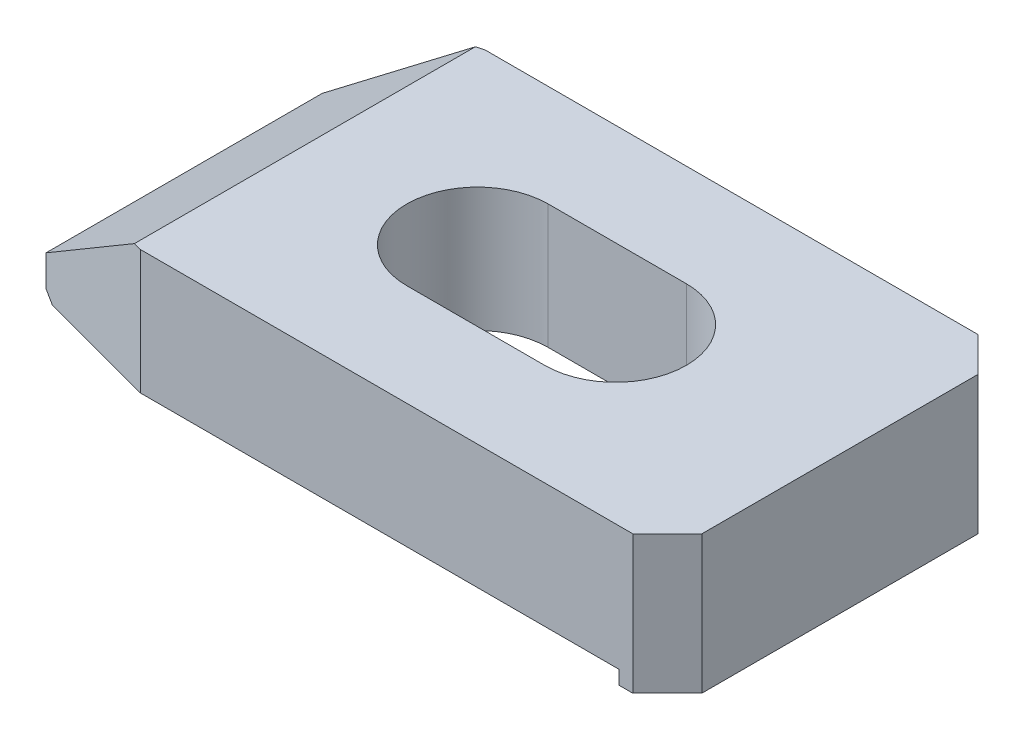
ISO-10303-21;
HEADER;
FILE_DESCRIPTION(('STEP AP214'),'2;1');
FILE_NAME('part.step','',(''),(''),'','','');
FILE_SCHEMA(('AUTOMOTIVE_DESIGN { 1 0 10303 214 1 1 1 1 }'));
ENDSEC;
DATA;
#1=APPLICATION_CONTEXT('core data for automotive mechanical design processes');
#2=APPLICATION_PROTOCOL_DEFINITION('international standard','automotive_design',2000,#1);
#3=PRODUCT_CONTEXT('',#1,'mechanical');
#4=PRODUCT('Part','Part','',(#3));
#5=PRODUCT_RELATED_PRODUCT_CATEGORY('part','',(#4));
#6=PRODUCT_DEFINITION_FORMATION('','',#4);
#7=PRODUCT_DEFINITION_CONTEXT('part definition',#1,'design');
#8=PRODUCT_DEFINITION('design','',#6,#7);
#9=PRODUCT_DEFINITION_SHAPE('','',#8);
#10=(LENGTH_UNIT() NAMED_UNIT(*) SI_UNIT(.MILLI.,.METRE.));
#11=(NAMED_UNIT(*) PLANE_ANGLE_UNIT() SI_UNIT($,.RADIAN.));
#12=(NAMED_UNIT(*) SI_UNIT($,.STERADIAN.) SOLID_ANGLE_UNIT());
#13=UNCERTAINTY_MEASURE_WITH_UNIT(LENGTH_MEASURE(1.E-05),#10,'distance_accuracy_value','');
#14=(GEOMETRIC_REPRESENTATION_CONTEXT(3) GLOBAL_UNCERTAINTY_ASSIGNED_CONTEXT((#13)) GLOBAL_UNIT_ASSIGNED_CONTEXT((#10,
#11,#12)) REPRESENTATION_CONTEXT('',''));
#15=CARTESIAN_POINT('',(0.,0.,0.));
#16=DIRECTION('',(0.,0.,1.));
#17=DIRECTION('',(1.,0.,0.));
#18=AXIS2_PLACEMENT_3D('',#15,#16,#17);
#19=CARTESIAN_POINT('',(0.,-2.,0.));
#20=DIRECTION('',(0.,1.,0.));
#21=DIRECTION('',(0.,0.,1.));
#22=AXIS2_PLACEMENT_3D('',#19,#20,#21);
#23=PLANE('',#22);
#24=DIRECTION('',(0.,0.,-1.));
#25=VECTOR('',#24,1.);
#26=CARTESIAN_POINT('',(17.6,-2.,-5.));
#27=LINE('',#26,#25);
#28=CARTESIAN_POINT('',(17.6,-2.,5.));
#29=VERTEX_POINT('',#28);
#30=CARTESIAN_POINT('',(17.6,-2.,-5.));
#31=VERTEX_POINT('',#30);
#32=EDGE_CURVE('E176',#29,#31,#27,.T.);
#33=ORIENTED_EDGE('',*,*,#32,.T.);
#34=DIRECTION('',(-1.,0.,0.));
#35=VECTOR('',#34,1.);
#36=CARTESIAN_POINT('',(0.,-2.,-5.));
#37=LINE('',#36,#35);
#38=CARTESIAN_POINT('',(18.,-2.,-5.));
#39=VERTEX_POINT('',#38);
#40=EDGE_CURVE('E203',#39,#31,#37,.T.);
#41=ORIENTED_EDGE('',*,*,#40,.F.);
#42=DIRECTION('',(-0.707106781186546,0.,-0.707106781186549));
#43=VECTOR('',#42,1.);
#44=CARTESIAN_POINT('',(18.,-2.,-5.));
#45=LINE('',#44,#43);
#46=CARTESIAN_POINT('',(19.,-2.,-4.));
#47=VERTEX_POINT('',#46);
#48=EDGE_CURVE('E210',#39,#47,#45,.F.);
#49=ORIENTED_EDGE('',*,*,#48,.T.);
#50=DIRECTION('',(0.,0.,-1.));
#51=VECTOR('',#50,1.);
#52=CARTESIAN_POINT('',(19.,-2.,-5.));
#53=LINE('',#52,#51);
#54=CARTESIAN_POINT('',(19.,-2.,4.));
#55=VERTEX_POINT('',#54);
#56=EDGE_CURVE('E198',#55,#47,#53,.T.);
#57=ORIENTED_EDGE('',*,*,#56,.F.);
#58=DIRECTION('',(0.707106781186549,0.,-0.707106781186546));
#59=VECTOR('',#58,1.);
#60=CARTESIAN_POINT('',(19.,-2.,4.));
#61=LINE('',#60,#59);
#62=CARTESIAN_POINT('',(18.,-2.,5.));
#63=VERTEX_POINT('',#62);
#64=EDGE_CURVE('E189',#55,#63,#61,.F.);
#65=ORIENTED_EDGE('',*,*,#64,.T.);
#66=DIRECTION('',(1.,0.,0.));
#67=VECTOR('',#66,1.);
#68=CARTESIAN_POINT('',(0.,-2.,5.));
#69=LINE('',#68,#67);
#70=EDGE_CURVE('E195',#29,#63,#69,.T.);
#71=ORIENTED_EDGE('',*,*,#70,.F.);
#72=EDGE_LOOP('',(#33,#41,#49,#57,#65,#71));
#73=FACE_BOUND('',#72,.T.);
#74=ADVANCED_FACE('F39',(#73),#23,.F.);
#75=CARTESIAN_POINT('',(0.,2.,5.));
#76=DIRECTION('',(0.,0.,-1.));
#77=DIRECTION('',(-1.,0.,0.));
#78=AXIS2_PLACEMENT_3D('',#75,#76,#77);
#79=PLANE('',#78);
#80=DIRECTION('',(1.,0.,0.));
#81=VECTOR('',#80,1.);
#82=CARTESIAN_POINT('',(0.,2.,5.));
#83=LINE('',#82,#81);
#84=CARTESIAN_POINT('',(3.73205080756897,2.,5.));
#85=VERTEX_POINT('',#84);
#86=CARTESIAN_POINT('',(18.,2.,5.));
#87=VERTEX_POINT('',#86);
#88=EDGE_CURVE('E191',#85,#87,#83,.T.);
#89=ORIENTED_EDGE('',*,*,#88,.F.);
#90=DIRECTION('',(0.,1.,0.));
#91=VECTOR('',#90,1.);
#92=CARTESIAN_POINT('',(3.73205080756897,-2.,5.));
#93=LINE('',#92,#91);
#94=CARTESIAN_POINT('',(3.73205080756897,-1.6,5.));
#95=VERTEX_POINT('',#94);
#96=EDGE_CURVE('E164',#95,#85,#93,.T.);
#97=ORIENTED_EDGE('',*,*,#96,.F.);
#98=DIRECTION('',(1.,0.,0.));
#99=VECTOR('',#98,1.);
#100=CARTESIAN_POINT('',(0.,-1.6,5.));
#101=LINE('',#100,#99);
#102=CARTESIAN_POINT('',(17.6,-1.6,5.));
#103=VERTEX_POINT('',#102);
#104=EDGE_CURVE('E275',#95,#103,#101,.T.);
#105=ORIENTED_EDGE('',*,*,#104,.T.);
#106=DIRECTION('',(0.,-1.,0.));
#107=VECTOR('',#106,1.);
#108=CARTESIAN_POINT('',(17.6,-1.6,5.));
#109=LINE('',#108,#107);
#110=EDGE_CURVE('E289',#103,#29,#109,.T.);
#111=ORIENTED_EDGE('',*,*,#110,.T.);
#112=ORIENTED_EDGE('',*,*,#70,.T.);
#113=DIRECTION('',(0.,1.,0.));
#114=VECTOR('',#113,1.);
#115=CARTESIAN_POINT('',(18.,2.,5.));
#116=LINE('',#115,#114);
#117=EDGE_CURVE('E225',#63,#87,#116,.T.);
#118=ORIENTED_EDGE('',*,*,#117,.T.);
#119=EDGE_LOOP('',(#89,#97,#105,#111,#112,#118));
#120=FACE_BOUND('',#119,.T.);
#121=ADVANCED_FACE('F337',(#120),#79,.F.);
#122=CARTESIAN_POINT('',(0.,2.,-5.));
#123=DIRECTION('',(0.,0.,1.));
#124=DIRECTION('',(1.,0.,0.));
#125=AXIS2_PLACEMENT_3D('',#122,#123,#124);
#126=PLANE('',#125);
#127=DIRECTION('',(-1.,0.,0.));
#128=VECTOR('',#127,1.);
#129=CARTESIAN_POINT('',(0.,-1.6,-5.));
#130=LINE('',#129,#128);
#131=CARTESIAN_POINT('',(17.6,-1.6,-5.));
#132=VERTEX_POINT('',#131);
#133=CARTESIAN_POINT('',(3.73205080756898,-1.6,-5.));
#134=VERTEX_POINT('',#133);
#135=EDGE_CURVE('E174',#132,#134,#130,.T.);
#136=ORIENTED_EDGE('',*,*,#135,.T.);
#137=DIRECTION('',(0.,1.,0.));
#138=VECTOR('',#137,1.);
#139=CARTESIAN_POINT('',(3.73205080756897,-2.,-5.));
#140=LINE('',#139,#138);
#141=CARTESIAN_POINT('',(3.73205080756897,2.,-5.));
#142=VERTEX_POINT('',#141);
#143=EDGE_CURVE('E154',#134,#142,#140,.T.);
#144=ORIENTED_EDGE('',*,*,#143,.T.);
#145=DIRECTION('',(-1.,0.,0.));
#146=VECTOR('',#145,1.);
#147=CARTESIAN_POINT('',(0.,2.,-5.));
#148=LINE('',#147,#146);
#149=CARTESIAN_POINT('',(18.,2.,-5.));
#150=VERTEX_POINT('',#149);
#151=EDGE_CURVE('E170',#150,#142,#148,.T.);
#152=ORIENTED_EDGE('',*,*,#151,.F.);
#153=DIRECTION('',(0.,-1.,0.));
#154=VECTOR('',#153,1.);
#155=CARTESIAN_POINT('',(18.,2.,-5.));
#156=LINE('',#155,#154);
#157=EDGE_CURVE('E184',#150,#39,#156,.T.);
#158=ORIENTED_EDGE('',*,*,#157,.T.);
#159=ORIENTED_EDGE('',*,*,#40,.T.);
#160=DIRECTION('',(0.,-1.,0.));
#161=VECTOR('',#160,1.);
#162=CARTESIAN_POINT('',(17.6,-1.6,-5.));
#163=LINE('',#162,#161);
#164=EDGE_CURVE('E283',#132,#31,#163,.T.);
#165=ORIENTED_EDGE('',*,*,#164,.F.);
#166=EDGE_LOOP('',(#136,#144,#152,#158,#159,#165));
#167=FACE_BOUND('',#166,.T.);
#168=ADVANCED_FACE('F168',(#167),#126,.F.);
#169=CARTESIAN_POINT('',(0.,2.,0.));
#170=DIRECTION('',(0.,1.,0.));
#171=DIRECTION('',(0.,0.,1.));
#172=AXIS2_PLACEMENT_3D('',#169,#170,#171);
#173=PLANE('',#172);
#174=DIRECTION('',(0.96592582628907,0.,-0.258819045102515));
#175=VECTOR('',#174,1.);
#176=CARTESIAN_POINT('',(0.,2.,-4.));
#177=LINE('',#176,#175);
#178=CARTESIAN_POINT('',(3.50000000000002,2.,-4.93782217350891));
#179=VERTEX_POINT('',#178);
#180=EDGE_CURVE('E151',#179,#142,#177,.T.);
#181=ORIENTED_EDGE('',*,*,#180,.F.);
#182=DIRECTION('',(0.,0.,1.));
#183=VECTOR('',#182,1.);
#184=CARTESIAN_POINT('',(3.50000000000002,2.,4.));
#185=LINE('',#184,#183);
#186=CARTESIAN_POINT('',(3.50000000000002,2.,4.93782217350891));
#187=VERTEX_POINT('',#186);
#188=EDGE_CURVE('E238',#179,#187,#185,.T.);
#189=ORIENTED_EDGE('',*,*,#188,.T.);
#190=DIRECTION('',(-0.96592582628907,0.,-0.258819045102515));
#191=VECTOR('',#190,1.);
#192=CARTESIAN_POINT('',(3.73205080756897,2.,5.));
#193=LINE('',#192,#191);
#194=EDGE_CURVE('E268',#85,#187,#193,.T.);
#195=ORIENTED_EDGE('',*,*,#194,.F.);
#196=ORIENTED_EDGE('',*,*,#88,.T.);
#197=DIRECTION('',(-0.707106781186549,0.,0.707106781186546));
#198=VECTOR('',#197,1.);
#199=CARTESIAN_POINT('',(11.5,2.,11.5));
#200=LINE('',#199,#198);
#201=CARTESIAN_POINT('',(19.,2.,4.));
#202=VERTEX_POINT('',#201);
#203=EDGE_CURVE('E220',#87,#202,#200,.F.);
#204=ORIENTED_EDGE('',*,*,#203,.T.);
#205=DIRECTION('',(0.,0.,-1.));
#206=VECTOR('',#205,1.);
#207=CARTESIAN_POINT('',(19.,2.,-5.));
#208=LINE('',#207,#206);
#209=CARTESIAN_POINT('',(19.,2.,-4.));
#210=VERTEX_POINT('',#209);
#211=EDGE_CURVE('E185',#202,#210,#208,.T.);
#212=ORIENTED_EDGE('',*,*,#211,.T.);
#213=DIRECTION('',(0.707106781186546,0.,0.707106781186549));
#214=VECTOR('',#213,1.);
#215=CARTESIAN_POINT('',(11.5,2.,-11.5));
#216=LINE('',#215,#214);
#217=EDGE_CURVE('E182',#210,#150,#216,.F.);
#218=ORIENTED_EDGE('',*,*,#217,.T.);
#219=ORIENTED_EDGE('',*,*,#151,.T.);
#220=EDGE_LOOP('',(#181,#189,#195,#196,#204,#212,#218,#219));
#221=FACE_BOUND('',#220,.T.);
#222=DIRECTION('',(1.,0.,0.));
#223=VECTOR('',#222,1.);
#224=CARTESIAN_POINT('',(8.5,2.,2.05));
#225=LINE('',#224,#223);
#226=CARTESIAN_POINT('',(8.5,2.,2.05));
#227=VERTEX_POINT('',#226);
#228=CARTESIAN_POINT('',(12.5,2.,2.05));
#229=VERTEX_POINT('',#228);
#230=EDGE_CURVE('E305',#227,#229,#225,.T.);
#231=ORIENTED_EDGE('',*,*,#230,.F.);
#232=CARTESIAN_POINT('',(8.5,2.,0.));
#233=DIRECTION('',(0.,1.,0.));
#234=DIRECTION('',(0.,0.,1.));
#235=AXIS2_PLACEMENT_3D('',#232,#233,#234);
#236=CIRCLE('',#235,2.05);
#237=CARTESIAN_POINT('',(8.5,2.,-2.05));
#238=VERTEX_POINT('',#237);
#239=EDGE_CURVE('E302',#238,#227,#236,.T.);
#240=ORIENTED_EDGE('',*,*,#239,.F.);
#241=DIRECTION('',(-1.,0.,0.));
#242=VECTOR('',#241,1.);
#243=CARTESIAN_POINT('',(8.5,2.,-2.05));
#244=LINE('',#243,#242);
#245=CARTESIAN_POINT('',(12.5,2.,-2.05));
#246=VERTEX_POINT('',#245);
#247=EDGE_CURVE('E312',#246,#238,#244,.T.);
#248=ORIENTED_EDGE('',*,*,#247,.F.);
#249=CARTESIAN_POINT('',(12.5,2.,0.));
#250=DIRECTION('',(0.,1.,0.));
#251=DIRECTION('',(0.,0.,1.));
#252=AXIS2_PLACEMENT_3D('',#249,#250,#251);
#253=CIRCLE('',#252,2.05);
#254=EDGE_CURVE('E308',#229,#246,#253,.T.);
#255=ORIENTED_EDGE('',*,*,#254,.F.);
#256=EDGE_LOOP('',(#231,#240,#248,#255));
#257=FACE_BOUND('',#256,.T.);
#258=ADVANCED_FACE('F178',(#221,#257),#173,.T.);
#259=CARTESIAN_POINT('',(0.,2.,-5.));
#260=DIRECTION('',(1.,0.,0.));
#261=DIRECTION('',(0.,0.,-1.));
#262=AXIS2_PLACEMENT_3D('',#259,#260,#261);
#263=PLANE('',#262);
#264=DIRECTION('',(0.,1.,0.));
#265=VECTOR('',#264,1.);
#266=CARTESIAN_POINT('',(0.,-2.,-4.));
#267=LINE('',#266,#265);
#268=CARTESIAN_POINT('',(0.,-1.35,-4.));
#269=VERTEX_POINT('',#268);
#270=CARTESIAN_POINT('',(0.,-0.450726383733986,-4.));
#271=VERTEX_POINT('',#270);
#272=EDGE_CURVE('E163',#269,#271,#267,.T.);
#273=ORIENTED_EDGE('',*,*,#272,.F.);
#274=DIRECTION('',(0.,0.,1.));
#275=VECTOR('',#274,1.);
#276=CARTESIAN_POINT('',(0.,-1.35,-5.));
#277=LINE('',#276,#275);
#278=CARTESIAN_POINT('',(0.,-1.35,4.));
#279=VERTEX_POINT('',#278);
#280=EDGE_CURVE('E251',#269,#279,#277,.T.);
#281=ORIENTED_EDGE('',*,*,#280,.T.);
#282=DIRECTION('',(0.,1.,0.));
#283=VECTOR('',#282,1.);
#284=CARTESIAN_POINT('',(0.,-2.,4.));
#285=LINE('',#284,#283);
#286=CARTESIAN_POINT('',(0.,-0.450726383733986,4.));
#287=VERTEX_POINT('',#286);
#288=EDGE_CURVE('E261',#279,#287,#285,.T.);
#289=ORIENTED_EDGE('',*,*,#288,.T.);
#290=DIRECTION('',(0.,0.,-1.));
#291=VECTOR('',#290,1.);
#292=CARTESIAN_POINT('',(0.,-0.450726383733986,-4.));
#293=LINE('',#292,#291);
#294=EDGE_CURVE('E245',#287,#271,#293,.T.);
#295=ORIENTED_EDGE('',*,*,#294,.T.);
#296=EDGE_LOOP('',(#273,#281,#289,#295));
#297=FACE_BOUND('',#296,.T.);
#298=ADVANCED_FACE('F260',(#297),#263,.F.);
#299=CARTESIAN_POINT('',(19.,2.,-5.));
#300=DIRECTION('',(-1.,0.,0.));
#301=DIRECTION('',(0.,0.,1.));
#302=AXIS2_PLACEMENT_3D('',#299,#300,#301);
#303=PLANE('',#302);
#304=ORIENTED_EDGE('',*,*,#56,.T.);
#305=DIRECTION('',(0.,1.,0.));
#306=VECTOR('',#305,1.);
#307=CARTESIAN_POINT('',(19.,2.,-4.));
#308=LINE('',#307,#306);
#309=EDGE_CURVE('E217',#47,#210,#308,.T.);
#310=ORIENTED_EDGE('',*,*,#309,.T.);
#311=ORIENTED_EDGE('',*,*,#211,.F.);
#312=DIRECTION('',(0.,-1.,0.));
#313=VECTOR('',#312,1.);
#314=CARTESIAN_POINT('',(19.,2.,4.));
#315=LINE('',#314,#313);
#316=EDGE_CURVE('E213',#202,#55,#315,.T.);
#317=ORIENTED_EDGE('',*,*,#316,.T.);
#318=EDGE_LOOP('',(#304,#310,#311,#317));
#319=FACE_BOUND('',#318,.T.);
#320=ADVANCED_FACE('F344',(#319),#303,.F.);
#321=CARTESIAN_POINT('',(8.5,2.,0.));
#322=DIRECTION('',(0.,-1.,0.));
#323=DIRECTION('',(0.,0.,-1.));
#324=AXIS2_PLACEMENT_3D('',#321,#322,#323);
#325=CYLINDRICAL_SURFACE('',#324,2.05);
#326=CARTESIAN_POINT('',(8.5,-1.6,0.));
#327=DIRECTION('',(0.,1.,0.));
#328=DIRECTION('',(0.,0.,1.));
#329=AXIS2_PLACEMENT_3D('',#326,#327,#328);
#330=CIRCLE('',#329,2.05);
#331=CARTESIAN_POINT('',(8.5,-1.6,-2.05));
#332=VERTEX_POINT('',#331);
#333=CARTESIAN_POINT('',(8.5,-1.6,2.05));
#334=VERTEX_POINT('',#333);
#335=EDGE_CURVE('E299',#332,#334,#330,.T.);
#336=ORIENTED_EDGE('',*,*,#335,.F.);
#337=DIRECTION('',(0.,-1.,0.));
#338=VECTOR('',#337,1.);
#339=CARTESIAN_POINT('',(8.5,2.,-2.05));
#340=LINE('',#339,#338);
#341=EDGE_CURVE('E315',#238,#332,#340,.T.);
#342=ORIENTED_EDGE('',*,*,#341,.F.);
#343=ORIENTED_EDGE('',*,*,#239,.T.);
#344=DIRECTION('',(0.,-1.,0.));
#345=VECTOR('',#344,1.);
#346=CARTESIAN_POINT('',(8.5,2.,2.05));
#347=LINE('',#346,#345);
#348=EDGE_CURVE('E199',#227,#334,#347,.T.);
#349=ORIENTED_EDGE('',*,*,#348,.T.);
#350=EDGE_LOOP('',(#336,#342,#343,#349));
#351=FACE_BOUND('',#350,.T.);
#352=ADVANCED_FACE('F374',(#351),#325,.F.);
#353=CARTESIAN_POINT('',(8.5,2.,2.05));
#354=DIRECTION('',(0.,0.,-1.));
#355=DIRECTION('',(-1.,0.,0.));
#356=AXIS2_PLACEMENT_3D('',#353,#354,#355);
#357=PLANE('',#356);
#358=DIRECTION('',(1.,0.,0.));
#359=VECTOR('',#358,1.);
#360=CARTESIAN_POINT('',(8.5,-1.6,2.05));
#361=LINE('',#360,#359);
#362=CARTESIAN_POINT('',(12.5,-1.6,2.05));
#363=VERTEX_POINT('',#362);
#364=EDGE_CURVE('E296',#334,#363,#361,.T.);
#365=ORIENTED_EDGE('',*,*,#364,.F.);
#366=ORIENTED_EDGE('',*,*,#348,.F.);
#367=ORIENTED_EDGE('',*,*,#230,.T.);
#368=DIRECTION('',(0.,-1.,0.));
#369=VECTOR('',#368,1.);
#370=CARTESIAN_POINT('',(12.5,2.,2.05));
#371=LINE('',#370,#369);
#372=EDGE_CURVE('E323',#229,#363,#371,.T.);
#373=ORIENTED_EDGE('',*,*,#372,.T.);
#374=EDGE_LOOP('',(#365,#366,#367,#373));
#375=FACE_BOUND('',#374,.T.);
#376=ADVANCED_FACE('F399',(#375),#357,.T.);
#377=CARTESIAN_POINT('',(12.5,2.,0.));
#378=DIRECTION('',(0.,-1.,0.));
#379=DIRECTION('',(0.,0.,-1.));
#380=AXIS2_PLACEMENT_3D('',#377,#378,#379);
#381=CYLINDRICAL_SURFACE('',#380,2.05);
#382=CARTESIAN_POINT('',(12.5,-1.6,0.));
#383=DIRECTION('',(0.,1.,0.));
#384=DIRECTION('',(0.,0.,1.));
#385=AXIS2_PLACEMENT_3D('',#382,#383,#384);
#386=CIRCLE('',#385,2.05);
#387=CARTESIAN_POINT('',(12.5,-1.6,-2.05));
#388=VERTEX_POINT('',#387);
#389=EDGE_CURVE('E293',#363,#388,#386,.T.);
#390=ORIENTED_EDGE('',*,*,#389,.F.);
#391=ORIENTED_EDGE('',*,*,#372,.F.);
#392=ORIENTED_EDGE('',*,*,#254,.T.);
#393=DIRECTION('',(0.,-1.,0.));
#394=VECTOR('',#393,1.);
#395=CARTESIAN_POINT('',(12.5,2.,-2.05));
#396=LINE('',#395,#394);
#397=EDGE_CURVE('E319',#246,#388,#396,.T.);
#398=ORIENTED_EDGE('',*,*,#397,.T.);
#399=EDGE_LOOP('',(#390,#391,#392,#398));
#400=FACE_BOUND('',#399,.T.);
#401=ADVANCED_FACE('F395',(#400),#381,.F.);
#402=CARTESIAN_POINT('',(8.5,2.,-2.05));
#403=DIRECTION('',(0.,0.,1.));
#404=DIRECTION('',(1.,0.,0.));
#405=AXIS2_PLACEMENT_3D('',#402,#403,#404);
#406=PLANE('',#405);
#407=DIRECTION('',(-1.,0.,0.));
#408=VECTOR('',#407,1.);
#409=CARTESIAN_POINT('',(8.5,-1.6,-2.05));
#410=LINE('',#409,#408);
#411=EDGE_CURVE('E229',#388,#332,#410,.T.);
#412=ORIENTED_EDGE('',*,*,#411,.F.);
#413=ORIENTED_EDGE('',*,*,#397,.F.);
#414=ORIENTED_EDGE('',*,*,#247,.T.);
#415=ORIENTED_EDGE('',*,*,#341,.T.);
#416=EDGE_LOOP('',(#412,#413,#414,#415));
#417=FACE_BOUND('',#416,.T.);
#418=ADVANCED_FACE('F380',(#417),#406,.T.);
#419=CARTESIAN_POINT('',(18.,2.,-5.));
#420=DIRECTION('',(-0.707106781186549,0.,0.707106781186546));
#421=DIRECTION('',(0.,-1.,0.));
#422=AXIS2_PLACEMENT_3D('',#419,#420,#421);
#423=PLANE('',#422);
#424=ORIENTED_EDGE('',*,*,#217,.F.);
#425=ORIENTED_EDGE('',*,*,#309,.F.);
#426=ORIENTED_EDGE('',*,*,#48,.F.);
#427=ORIENTED_EDGE('',*,*,#157,.F.);
#428=EDGE_LOOP('',(#424,#425,#426,#427));
#429=FACE_BOUND('',#428,.T.);
#430=ADVANCED_FACE('F349',(#429),#423,.F.);
#431=CARTESIAN_POINT('',(19.,2.,4.));
#432=DIRECTION('',(-0.707106781186546,0.,-0.707106781186549));
#433=DIRECTION('',(0.,-1.,0.));
#434=AXIS2_PLACEMENT_3D('',#431,#432,#433);
#435=PLANE('',#434);
#436=ORIENTED_EDGE('',*,*,#203,.F.);
#437=ORIENTED_EDGE('',*,*,#117,.F.);
#438=ORIENTED_EDGE('',*,*,#64,.F.);
#439=ORIENTED_EDGE('',*,*,#316,.F.);
#440=EDGE_LOOP('',(#436,#437,#438,#439));
#441=FACE_BOUND('',#440,.T.);
#442=ADVANCED_FACE('F341',(#441),#435,.F.);
#443=CARTESIAN_POINT('',(17.6,-1.6,-5.));
#444=DIRECTION('',(-1.,0.,0.));
#445=DIRECTION('',(0.,0.,1.));
#446=AXIS2_PLACEMENT_3D('',#443,#444,#445);
#447=PLANE('',#446);
#448=ORIENTED_EDGE('',*,*,#32,.F.);
#449=ORIENTED_EDGE('',*,*,#110,.F.);
#450=DIRECTION('',(0.,0.,-1.));
#451=VECTOR('',#450,1.);
#452=CARTESIAN_POINT('',(17.6,-1.6,-5.));
#453=LINE('',#452,#451);
#454=EDGE_CURVE('E278',#103,#132,#453,.T.);
#455=ORIENTED_EDGE('',*,*,#454,.T.);
#456=ORIENTED_EDGE('',*,*,#164,.T.);
#457=EDGE_LOOP('',(#448,#449,#455,#456));
#458=FACE_BOUND('',#457,.T.);
#459=ADVANCED_FACE('F351',(#458),#447,.T.);
#460=CARTESIAN_POINT('',(0.,-1.6,0.));
#461=DIRECTION('',(0.,1.,0.));
#462=DIRECTION('',(0.,0.,1.));
#463=AXIS2_PLACEMENT_3D('',#460,#461,#462);
#464=PLANE('',#463);
#465=ORIENTED_EDGE('',*,*,#335,.T.);
#466=ORIENTED_EDGE('',*,*,#364,.T.);
#467=ORIENTED_EDGE('',*,*,#389,.T.);
#468=ORIENTED_EDGE('',*,*,#411,.T.);
#469=EDGE_LOOP('',(#465,#466,#467,#468));
#470=FACE_BOUND('',#469,.T.);
#471=DIRECTION('',(-0.96592582628907,0.,-0.258819045102515));
#472=VECTOR('',#471,1.);
#473=CARTESIAN_POINT('',(-0.999999999999978,-1.6,3.73205080756889));
#474=LINE('',#473,#472);
#475=CARTESIAN_POINT('',(0.250000000000001,-1.6,4.06698729810778));
#476=VERTEX_POINT('',#475);
#477=EDGE_CURVE('E232',#95,#476,#474,.T.);
#478=ORIENTED_EDGE('',*,*,#477,.T.);
#479=DIRECTION('',(0.,0.,-1.));
#480=VECTOR('',#479,1.);
#481=CARTESIAN_POINT('',(0.250000000000001,-1.6,0.));
#482=LINE('',#481,#480);
#483=CARTESIAN_POINT('',(0.250000000000001,-1.6,-4.06698729810778));
#484=VERTEX_POINT('',#483);
#485=EDGE_CURVE('E48',#476,#484,#482,.T.);
#486=ORIENTED_EDGE('',*,*,#485,.T.);
#487=DIRECTION('',(0.96592582628907,0.,-0.258819045102515));
#488=VECTOR('',#487,1.);
#489=CARTESIAN_POINT('',(-0.999999999999978,-1.6,-3.73205080756889));
#490=LINE('',#489,#488);
#491=EDGE_CURVE('E235',#484,#134,#490,.T.);
#492=ORIENTED_EDGE('',*,*,#491,.T.);
#493=ORIENTED_EDGE('',*,*,#135,.F.);
#494=ORIENTED_EDGE('',*,*,#454,.F.);
#495=ORIENTED_EDGE('',*,*,#104,.F.);
#496=EDGE_LOOP('',(#478,#486,#492,#493,#494,#495));
#497=FACE_BOUND('',#496,.T.);
#498=ADVANCED_FACE('F355',(#470,#497),#464,.F.);
#499=CARTESIAN_POINT('',(3.73205080756897,-2.,5.));
#500=DIRECTION('',(0.258819045102515,0.,-0.96592582628907));
#501=DIRECTION('',(-0.96592582628907,0.,-0.258819045102515));
#502=AXIS2_PLACEMENT_3D('',#499,#500,#501);
#503=PLANE('',#502);
#504=ORIENTED_EDGE('',*,*,#288,.F.);
#505=DIRECTION('',(-0.694746590606871,0.694746590606862,-0.186156787897382));
#506=VECTOR('',#505,1.);
#507=CARTESIAN_POINT('',(-1.16398614339029,-0.186013856609725,3.68811085287756));
#508=LINE('',#507,#506);
#509=EDGE_CURVE('E62',#279,#476,#508,.F.);
#510=ORIENTED_EDGE('',*,*,#509,.T.);
#511=ORIENTED_EDGE('',*,*,#477,.F.);
#512=ORIENTED_EDGE('',*,*,#96,.T.);
#513=ORIENTED_EDGE('',*,*,#194,.T.);
#514=DIRECTION('',(-0.800105655156675,-0.56024001110492,-0.2143876641588));
#515=VECTOR('',#514,1.);
#516=CARTESIAN_POINT('',(2.65300162314074,1.40692535167175,4.710869642439));
#517=LINE('',#516,#515);
#518=EDGE_CURVE('E241',#187,#287,#517,.T.);
#519=ORIENTED_EDGE('',*,*,#518,.T.);
#520=EDGE_LOOP('',(#504,#510,#511,#512,#513,#519));
#521=FACE_BOUND('',#520,.T.);
#522=ADVANCED_FACE('F264',(#521),#503,.F.);
#523=CARTESIAN_POINT('',(0.,-2.,-4.));
#524=DIRECTION('',(0.258819045102515,0.,0.96592582628907));
#525=DIRECTION('',(0.96592582628907,0.,-0.258819045102515));
#526=AXIS2_PLACEMENT_3D('',#523,#524,#525);
#527=PLANE('',#526);
#528=ORIENTED_EDGE('',*,*,#491,.F.);
#529=DIRECTION('',(0.694746590606871,-0.694746590606862,-0.186156787897382));
#530=VECTOR('',#529,1.);
#531=CARTESIAN_POINT('',(0.129331793710034,-1.47933179371003,-4.03465434968027));
#532=LINE('',#531,#530);
#533=EDGE_CURVE('E11',#484,#269,#532,.F.);
#534=ORIENTED_EDGE('',*,*,#533,.T.);
#535=ORIENTED_EDGE('',*,*,#272,.T.);
#536=DIRECTION('',(0.800105655156675,0.56024001110492,-0.2143876641588));
#537=VECTOR('',#536,1.);
#538=CARTESIAN_POINT('',(2.65300162314074,1.40692535167175,-4.710869642439));
#539=LINE('',#538,#537);
#540=EDGE_CURVE('E157',#271,#179,#539,.T.);
#541=ORIENTED_EDGE('',*,*,#540,.T.);
#542=ORIENTED_EDGE('',*,*,#180,.T.);
#543=ORIENTED_EDGE('',*,*,#143,.F.);
#544=EDGE_LOOP('',(#528,#534,#535,#541,#542,#543));
#545=FACE_BOUND('',#544,.T.);
#546=ADVANCED_FACE('F153',(#545),#527,.F.);
#547=CARTESIAN_POINT('',(3.50000000000002,2.,0.));
#548=DIRECTION('',(-0.573576436351044,0.819152044288993,0.));
#549=DIRECTION('',(0.,0.,-1.));
#550=AXIS2_PLACEMENT_3D('',#547,#548,#549);
#551=PLANE('',#550);
#552=ORIENTED_EDGE('',*,*,#540,.F.);
#553=ORIENTED_EDGE('',*,*,#294,.F.);
#554=ORIENTED_EDGE('',*,*,#518,.F.);
#555=ORIENTED_EDGE('',*,*,#188,.F.);
#556=EDGE_LOOP('',(#552,#553,#554,#555));
#557=FACE_BOUND('',#556,.T.);
#558=ADVANCED_FACE('F357',(#557),#551,.T.);
#559=CARTESIAN_POINT('',(0.,-1.35,-5.));
#560=DIRECTION('',(0.707106781186543,0.707106781186552,0.));
#561=DIRECTION('',(0.,0.,1.));
#562=AXIS2_PLACEMENT_3D('',#559,#560,#561);
#563=PLANE('',#562);
#564=ORIENTED_EDGE('',*,*,#533,.F.);
#565=ORIENTED_EDGE('',*,*,#485,.F.);
#566=ORIENTED_EDGE('',*,*,#509,.F.);
#567=ORIENTED_EDGE('',*,*,#280,.F.);
#568=EDGE_LOOP('',(#564,#565,#566,#567));
#569=FACE_BOUND('',#568,.T.);
#570=ADVANCED_FACE('F41',(#569),#563,.F.);
#571=CLOSED_SHELL('',(#74,#121,#168,#258,#298,#320,#352,#376,#401,#418,#430,#442,#459,#498,#522,
#546,#558,#570));
#572=MANIFOLD_SOLID_BREP('B2',#571);
#573=ADVANCED_BREP_SHAPE_REPRESENTATION('',(#18,#572),#14);
#574=SHAPE_DEFINITION_REPRESENTATION(#9,#573);
ENDSEC;
END-ISO-10303-21;
